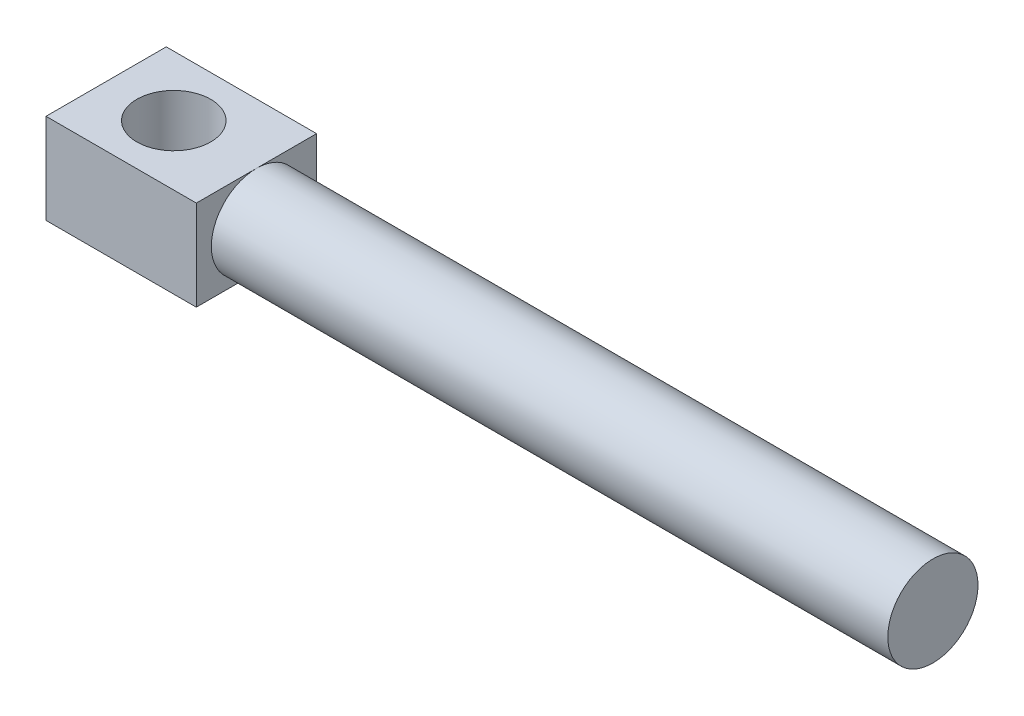
ISO-10303-21;
HEADER;
FILE_DESCRIPTION(('STEP AP214'),'2;1');
FILE_NAME('part.step','',(''),(''),'','','');
FILE_SCHEMA(('AUTOMOTIVE_DESIGN { 1 0 10303 214 1 1 1 1 }'));
ENDSEC;
DATA;
#1=APPLICATION_CONTEXT('core data for automotive mechanical design processes');
#2=APPLICATION_PROTOCOL_DEFINITION('international standard','automotive_design',2000,#1);
#3=PRODUCT_CONTEXT('',#1,'mechanical');
#4=PRODUCT('Part','Part','',(#3));
#5=PRODUCT_RELATED_PRODUCT_CATEGORY('part','',(#4));
#6=PRODUCT_DEFINITION_FORMATION('','',#4);
#7=PRODUCT_DEFINITION_CONTEXT('part definition',#1,'design');
#8=PRODUCT_DEFINITION('design','',#6,#7);
#9=PRODUCT_DEFINITION_SHAPE('','',#8);
#10=(LENGTH_UNIT() NAMED_UNIT(*) SI_UNIT(.MILLI.,.METRE.));
#11=(NAMED_UNIT(*) PLANE_ANGLE_UNIT() SI_UNIT($,.RADIAN.));
#12=(NAMED_UNIT(*) SI_UNIT($,.STERADIAN.) SOLID_ANGLE_UNIT());
#13=UNCERTAINTY_MEASURE_WITH_UNIT(LENGTH_MEASURE(1.E-05),#10,'distance_accuracy_value','');
#14=(GEOMETRIC_REPRESENTATION_CONTEXT(3) GLOBAL_UNCERTAINTY_ASSIGNED_CONTEXT((#13)) GLOBAL_UNIT_ASSIGNED_CONTEXT((#10,
#11,#12)) REPRESENTATION_CONTEXT('',''));
#15=CARTESIAN_POINT('',(0.,0.,0.));
#16=DIRECTION('',(0.,0.,1.));
#17=DIRECTION('',(1.,0.,0.));
#18=AXIS2_PLACEMENT_3D('',#15,#16,#17);
#19=CARTESIAN_POINT('',(5.,6.,-4.));
#20=DIRECTION('',(-1.,0.,0.));
#21=DIRECTION('',(0.,0.,1.));
#22=AXIS2_PLACEMENT_3D('',#19,#20,#21);
#23=PLANE('',#22);
#24=CARTESIAN_POINT('',(5.,3.,0.));
#25=DIRECTION('',(1.,0.,0.));
#26=DIRECTION('',(0.,0.,-1.));
#27=AXIS2_PLACEMENT_3D('',#24,#25,#26);
#28=CIRCLE('',#27,3.);
#29=CARTESIAN_POINT('',(5.,6.,0.));
#30=VERTEX_POINT('',#29);
#31=CARTESIAN_POINT('',(5.,0.,0.));
#32=VERTEX_POINT('',#31);
#33=EDGE_CURVE('E47',#30,#32,#28,.T.);
#34=ORIENTED_EDGE('',*,*,#33,.F.);
#35=DIRECTION('',(0.,0.,-1.));
#36=VECTOR('',#35,1.);
#37=CARTESIAN_POINT('',(5.,6.,-4.));
#38=LINE('',#37,#36);
#39=CARTESIAN_POINT('',(5.,6.,4.));
#40=VERTEX_POINT('',#39);
#41=EDGE_CURVE('E90',#40,#30,#38,.T.);
#42=ORIENTED_EDGE('',*,*,#41,.F.);
#43=DIRECTION('',(0.,-1.,0.));
#44=VECTOR('',#43,1.);
#45=CARTESIAN_POINT('',(5.,6.,4.));
#46=LINE('',#45,#44);
#47=CARTESIAN_POINT('',(5.,0.,4.));
#48=VERTEX_POINT('',#47);
#49=EDGE_CURVE('E159',#40,#48,#46,.T.);
#50=ORIENTED_EDGE('',*,*,#49,.T.);
#51=DIRECTION('',(0.,0.,-1.));
#52=VECTOR('',#51,1.);
#53=CARTESIAN_POINT('',(5.,0.,-4.));
#54=LINE('',#53,#52);
#55=EDGE_CURVE('E101',#48,#32,#54,.T.);
#56=ORIENTED_EDGE('',*,*,#55,.T.);
#57=EDGE_LOOP('',(#34,#42,#50,#56));
#58=FACE_BOUND('',#57,.T.);
#59=ADVANCED_FACE('F37',(#58),#23,.F.);
#60=EDGE_CURVE('E11',#32,#30,#28,.T.);
#61=ORIENTED_EDGE('',*,*,#60,.F.);
#62=CARTESIAN_POINT('',(5.,0.,-4.));
#63=VERTEX_POINT('',#62);
#64=EDGE_CURVE('E153',#32,#63,#54,.T.);
#65=ORIENTED_EDGE('',*,*,#64,.T.);
#66=DIRECTION('',(0.,-1.,0.));
#67=VECTOR('',#66,1.);
#68=CARTESIAN_POINT('',(5.,6.,-4.));
#69=LINE('',#68,#67);
#70=CARTESIAN_POINT('',(5.,6.,-4.));
#71=VERTEX_POINT('',#70);
#72=EDGE_CURVE('E41',#71,#63,#69,.T.);
#73=ORIENTED_EDGE('',*,*,#72,.F.);
#74=EDGE_CURVE('E86',#30,#71,#38,.T.);
#75=ORIENTED_EDGE('',*,*,#74,.F.);
#76=EDGE_LOOP('',(#61,#65,#73,#75));
#77=FACE_BOUND('',#76,.T.);
#78=ADVANCED_FACE('F39',(#77),#23,.F.);
#79=CARTESIAN_POINT('',(-5.,6.,-4.));
#80=DIRECTION('',(0.,0.,1.));
#81=DIRECTION('',(1.,0.,0.));
#82=AXIS2_PLACEMENT_3D('',#79,#80,#81);
#83=PLANE('',#82);
#84=DIRECTION('',(-1.,0.,0.));
#85=VECTOR('',#84,1.);
#86=CARTESIAN_POINT('',(-5.,0.,-4.));
#87=LINE('',#86,#85);
#88=CARTESIAN_POINT('',(-5.,0.,-4.));
#89=VERTEX_POINT('',#88);
#90=EDGE_CURVE('E161',#63,#89,#87,.T.);
#91=ORIENTED_EDGE('',*,*,#90,.T.);
#92=DIRECTION('',(0.,-1.,0.));
#93=VECTOR('',#92,1.);
#94=CARTESIAN_POINT('',(-5.,6.,-4.));
#95=LINE('',#94,#93);
#96=CARTESIAN_POINT('',(-5.,6.,-4.));
#97=VERTEX_POINT('',#96);
#98=EDGE_CURVE('E168',#97,#89,#95,.T.);
#99=ORIENTED_EDGE('',*,*,#98,.F.);
#100=DIRECTION('',(-1.,0.,0.));
#101=VECTOR('',#100,1.);
#102=CARTESIAN_POINT('',(-5.,6.,-4.));
#103=LINE('',#102,#101);
#104=EDGE_CURVE('E94',#71,#97,#103,.T.);
#105=ORIENTED_EDGE('',*,*,#104,.F.);
#106=ORIENTED_EDGE('',*,*,#72,.T.);
#107=EDGE_LOOP('',(#91,#99,#105,#106));
#108=FACE_BOUND('',#107,.T.);
#109=ADVANCED_FACE('F126',(#108),#83,.F.);
#110=CARTESIAN_POINT('',(-5.,6.,-4.));
#111=DIRECTION('',(1.,0.,0.));
#112=DIRECTION('',(0.,0.,-1.));
#113=AXIS2_PLACEMENT_3D('',#110,#111,#112);
#114=PLANE('',#113);
#115=DIRECTION('',(0.,0.,1.));
#116=VECTOR('',#115,1.);
#117=CARTESIAN_POINT('',(-5.,0.,-4.));
#118=LINE('',#117,#116);
#119=CARTESIAN_POINT('',(-5.,0.,4.));
#120=VERTEX_POINT('',#119);
#121=EDGE_CURVE('E163',#89,#120,#118,.T.);
#122=ORIENTED_EDGE('',*,*,#121,.T.);
#123=DIRECTION('',(0.,-1.,0.));
#124=VECTOR('',#123,1.);
#125=CARTESIAN_POINT('',(-5.,6.,4.));
#126=LINE('',#125,#124);
#127=CARTESIAN_POINT('',(-5.,6.,4.));
#128=VERTEX_POINT('',#127);
#129=EDGE_CURVE('E167',#128,#120,#126,.T.);
#130=ORIENTED_EDGE('',*,*,#129,.F.);
#131=DIRECTION('',(0.,0.,1.));
#132=VECTOR('',#131,1.);
#133=CARTESIAN_POINT('',(-5.,6.,-4.));
#134=LINE('',#133,#132);
#135=EDGE_CURVE('E156',#97,#128,#134,.T.);
#136=ORIENTED_EDGE('',*,*,#135,.F.);
#137=ORIENTED_EDGE('',*,*,#98,.T.);
#138=EDGE_LOOP('',(#122,#130,#136,#137));
#139=FACE_BOUND('',#138,.T.);
#140=ADVANCED_FACE('F130',(#139),#114,.F.);
#141=CARTESIAN_POINT('',(-5.,6.,4.));
#142=DIRECTION('',(0.,0.,-1.));
#143=DIRECTION('',(-1.,0.,0.));
#144=AXIS2_PLACEMENT_3D('',#141,#142,#143);
#145=PLANE('',#144);
#146=DIRECTION('',(1.,0.,0.));
#147=VECTOR('',#146,1.);
#148=CARTESIAN_POINT('',(-5.,0.,4.));
#149=LINE('',#148,#147);
#150=EDGE_CURVE('E81',#120,#48,#149,.T.);
#151=ORIENTED_EDGE('',*,*,#150,.T.);
#152=ORIENTED_EDGE('',*,*,#49,.F.);
#153=DIRECTION('',(1.,0.,0.));
#154=VECTOR('',#153,1.);
#155=CARTESIAN_POINT('',(-5.,6.,4.));
#156=LINE('',#155,#154);
#157=EDGE_CURVE('E61',#128,#40,#156,.T.);
#158=ORIENTED_EDGE('',*,*,#157,.F.);
#159=ORIENTED_EDGE('',*,*,#129,.T.);
#160=EDGE_LOOP('',(#151,#152,#158,#159));
#161=FACE_BOUND('',#160,.T.);
#162=ADVANCED_FACE('F135',(#161),#145,.F.);
#163=CARTESIAN_POINT('',(0.,6.,0.));
#164=DIRECTION('',(0.,1.,0.));
#165=DIRECTION('',(0.,0.,1.));
#166=AXIS2_PLACEMENT_3D('',#163,#164,#165);
#167=PLANE('',#166);
#168=CARTESIAN_POINT('',(-0.5,6.,0.));
#169=DIRECTION('',(0.,1.,0.));
#170=DIRECTION('',(0.,0.,1.));
#171=AXIS2_PLACEMENT_3D('',#168,#169,#170);
#172=CIRCLE('',#171,2.46);
#173=CARTESIAN_POINT('',(-0.5,6.,2.46));
#174=VERTEX_POINT('',#173);
#175=EDGE_CURVE('E146',#174,#174,#172,.T.);
#176=ORIENTED_EDGE('',*,*,#175,.F.);
#177=EDGE_LOOP('',(#176));
#178=FACE_BOUND('',#177,.T.);
#179=ORIENTED_EDGE('',*,*,#41,.T.);
#180=ORIENTED_EDGE('',*,*,#74,.T.);
#181=ORIENTED_EDGE('',*,*,#104,.T.);
#182=ORIENTED_EDGE('',*,*,#135,.T.);
#183=ORIENTED_EDGE('',*,*,#157,.T.);
#184=EDGE_LOOP('',(#179,#180,#181,#182,#183));
#185=FACE_BOUND('',#184,.T.);
#186=ADVANCED_FACE('F91',(#178,#185),#167,.T.);
#187=CARTESIAN_POINT('',(0.,0.,0.));
#188=DIRECTION('',(0.,1.,0.));
#189=DIRECTION('',(0.,0.,1.));
#190=AXIS2_PLACEMENT_3D('',#187,#188,#189);
#191=PLANE('',#190);
#192=CARTESIAN_POINT('',(-0.5,0.,0.));
#193=DIRECTION('',(0.,1.,0.));
#194=DIRECTION('',(0.,0.,1.));
#195=AXIS2_PLACEMENT_3D('',#192,#193,#194);
#196=CIRCLE('',#195,2.46);
#197=CARTESIAN_POINT('',(-0.5,0.,2.46));
#198=VERTEX_POINT('',#197);
#199=EDGE_CURVE('E104',#198,#198,#196,.F.);
#200=ORIENTED_EDGE('',*,*,#199,.F.);
#201=EDGE_LOOP('',(#200));
#202=FACE_BOUND('',#201,.T.);
#203=ORIENTED_EDGE('',*,*,#55,.F.);
#204=ORIENTED_EDGE('',*,*,#150,.F.);
#205=ORIENTED_EDGE('',*,*,#121,.F.);
#206=ORIENTED_EDGE('',*,*,#90,.F.);
#207=ORIENTED_EDGE('',*,*,#64,.F.);
#208=EDGE_LOOP('',(#203,#204,#205,#206,#207));
#209=FACE_BOUND('',#208,.T.);
#210=ADVANCED_FACE('F108',(#202,#209),#191,.F.);
#211=CARTESIAN_POINT('',(50.,3.,0.));
#212=DIRECTION('',(-1.,0.,0.));
#213=DIRECTION('',(0.,0.,1.));
#214=AXIS2_PLACEMENT_3D('',#211,#212,#213);
#215=CYLINDRICAL_SURFACE('',#214,3.);
#216=CARTESIAN_POINT('',(50.,3.,0.));
#217=DIRECTION('',(1.,0.,0.));
#218=DIRECTION('',(0.,0.,-1.));
#219=AXIS2_PLACEMENT_3D('',#216,#217,#218);
#220=CIRCLE('',#219,3.);
#221=CARTESIAN_POINT('',(50.,3.,-3.));
#222=VERTEX_POINT('',#221);
#223=EDGE_CURVE('E103',#222,#222,#220,.T.);
#224=ORIENTED_EDGE('',*,*,#223,.F.);
#225=EDGE_LOOP('',(#224));
#226=FACE_BOUND('',#225,.T.);
#227=ORIENTED_EDGE('',*,*,#33,.T.);
#228=ORIENTED_EDGE('',*,*,#60,.T.);
#229=EDGE_LOOP('',(#227,#228));
#230=FACE_BOUND('',#229,.T.);
#231=ADVANCED_FACE('F105',(#226,#230),#215,.T.);
#232=CARTESIAN_POINT('',(50.,0.,0.));
#233=DIRECTION('',(1.,0.,0.));
#234=DIRECTION('',(0.,0.,-1.));
#235=AXIS2_PLACEMENT_3D('',#232,#233,#234);
#236=PLANE('',#235);
#237=ORIENTED_EDGE('',*,*,#223,.T.);
#238=EDGE_LOOP('',(#237));
#239=FACE_BOUND('',#238,.T.);
#240=ADVANCED_FACE('F107',(#239),#236,.T.);
#241=CARTESIAN_POINT('',(-0.5,-0.00100000000000013,0.));
#242=DIRECTION('',(0.,1.,0.));
#243=DIRECTION('',(0.,0.,1.));
#244=AXIS2_PLACEMENT_3D('',#241,#242,#243);
#245=CYLINDRICAL_SURFACE('',#244,2.46);
#246=CARTESIAN_POINT('',(-0.5,6.,2.46));
#247=CARTESIAN_POINT('',(-0.5,5.9375,2.46));
#248=CARTESIAN_POINT('',(-0.5,5.875,2.46));
#249=CARTESIAN_POINT('',(-0.5,5.75,2.46));
#250=CARTESIAN_POINT('',(-0.5,5.6875,2.46));
#251=CARTESIAN_POINT('',(-0.5,5.5625,2.46));
#252=CARTESIAN_POINT('',(-0.5,5.5,2.46));
#253=CARTESIAN_POINT('',(-0.5,5.375,2.46));
#254=CARTESIAN_POINT('',(-0.5,5.3125,2.46));
#255=CARTESIAN_POINT('',(-0.5,5.1875,2.46));
#256=CARTESIAN_POINT('',(-0.5,5.125,2.46));
#257=CARTESIAN_POINT('',(-0.5,5.,2.46));
#258=CARTESIAN_POINT('',(-0.5,4.9375,2.46));
#259=CARTESIAN_POINT('',(-0.5,4.8125,2.46));
#260=CARTESIAN_POINT('',(-0.5,4.75,2.46));
#261=CARTESIAN_POINT('',(-0.5,4.625,2.46));
#262=CARTESIAN_POINT('',(-0.5,4.5625,2.46));
#263=CARTESIAN_POINT('',(-0.5,4.4375,2.46));
#264=CARTESIAN_POINT('',(-0.5,4.375,2.46));
#265=CARTESIAN_POINT('',(-0.5,4.25,2.46));
#266=CARTESIAN_POINT('',(-0.5,4.1875,2.46));
#267=CARTESIAN_POINT('',(-0.5,4.0625,2.46));
#268=CARTESIAN_POINT('',(-0.5,4.,2.46));
#269=CARTESIAN_POINT('',(-0.5,3.875,2.46));
#270=CARTESIAN_POINT('',(-0.5,3.8125,2.46));
#271=CARTESIAN_POINT('',(-0.5,3.6875,2.46));
#272=CARTESIAN_POINT('',(-0.5,3.625,2.46));
#273=CARTESIAN_POINT('',(-0.5,3.5,2.46));
#274=CARTESIAN_POINT('',(-0.5,3.4375,2.46));
#275=CARTESIAN_POINT('',(-0.5,3.3125,2.46));
#276=CARTESIAN_POINT('',(-0.5,3.25,2.46));
#277=CARTESIAN_POINT('',(-0.5,3.125,2.46));
#278=CARTESIAN_POINT('',(-0.5,3.0625,2.46));
#279=CARTESIAN_POINT('',(-0.5,2.9375,2.46));
#280=CARTESIAN_POINT('',(-0.5,2.875,2.46));
#281=CARTESIAN_POINT('',(-0.5,2.75,2.46));
#282=CARTESIAN_POINT('',(-0.5,2.6875,2.46));
#283=CARTESIAN_POINT('',(-0.5,2.5625,2.46));
#284=CARTESIAN_POINT('',(-0.5,2.5,2.46));
#285=CARTESIAN_POINT('',(-0.5,2.375,2.46));
#286=CARTESIAN_POINT('',(-0.5,2.3125,2.46));
#287=CARTESIAN_POINT('',(-0.5,2.1875,2.46));
#288=CARTESIAN_POINT('',(-0.5,2.125,2.46));
#289=CARTESIAN_POINT('',(-0.5,2.,2.46));
#290=CARTESIAN_POINT('',(-0.5,1.9375,2.46));
#291=CARTESIAN_POINT('',(-0.5,1.8125,2.46));
#292=CARTESIAN_POINT('',(-0.5,1.75,2.46));
#293=CARTESIAN_POINT('',(-0.5,1.625,2.46));
#294=CARTESIAN_POINT('',(-0.5,1.5625,2.46));
#295=CARTESIAN_POINT('',(-0.5,1.4375,2.46));
#296=CARTESIAN_POINT('',(-0.5,1.375,2.46));
#297=CARTESIAN_POINT('',(-0.5,1.25,2.46));
#298=CARTESIAN_POINT('',(-0.5,1.1875,2.46));
#299=CARTESIAN_POINT('',(-0.5,1.0625,2.46));
#300=CARTESIAN_POINT('',(-0.5,1.,2.46));
#301=CARTESIAN_POINT('',(-0.5,0.875,2.46));
#302=CARTESIAN_POINT('',(-0.5,0.8125,2.46));
#303=CARTESIAN_POINT('',(-0.5,0.6875,2.46));
#304=CARTESIAN_POINT('',(-0.5,0.625,2.46));
#305=CARTESIAN_POINT('',(-0.5,0.5,2.46));
#306=CARTESIAN_POINT('',(-0.5,0.4375,2.46));
#307=CARTESIAN_POINT('',(-0.5,0.3125,2.46));
#308=CARTESIAN_POINT('',(-0.5,0.25,2.46));
#309=CARTESIAN_POINT('',(-0.5,0.125,2.46));
#310=CARTESIAN_POINT('',(-0.5,0.0625000000000001,2.46));
#311=CARTESIAN_POINT('',(-0.5,0.,2.46));
#312=B_SPLINE_CURVE_WITH_KNOTS('',3,(#246,#247,#248,#249,#250,#251,#252,#253,#254,#255,#256,
#257,#258,#259,#260,#261,#262,#263,#264,#265,#266,#267,#268,#269,#270,#271,#272,#273,#274,#275,
#276,#277,#278,#279,#280,#281,#282,#283,#284,#285,#286,#287,#288,#289,#290,#291,#292,#293,#294,
#295,#296,#297,#298,#299,#300,#301,#302,#303,#304,#305,#306,#307,#308,#309,#310,#311),
.UNSPECIFIED.,.F.,.F.,(4,2,2,2,2,2,2,2,2,2,2,2,2,2,2,2,2,2,2,2,2,2,2,2,2,2,2,2,2,2,2,2,4),(0.,
0.1875,0.375,0.5625,0.75,0.9375,1.125,1.3125,1.5,1.6875,1.875,2.0625,2.25,2.4375,2.625,2.8125,
3.,3.1875,3.375,3.5625,3.75,3.9375,4.125,4.3125,4.5,4.6875,4.875,5.0625,5.25,5.4375,5.625,
5.8125,6.),.UNSPECIFIED.);
#313=EDGE_CURVE('BSEAM115',#174,#198,#312,.T.);
#314=ORIENTED_EDGE('',*,*,#175,.T.);
#315=ORIENTED_EDGE('',*,*,#199,.T.);
#316=ORIENTED_EDGE('',*,*,#313,.T.);
#317=ORIENTED_EDGE('',*,*,#313,.F.);
#318=EDGE_LOOP('',(#314,#316,#315,#317));
#319=FACE_BOUND('',#318,.T.);
#320=ADVANCED_FACE('F115',(#319),#245,.F.);
#321=CLOSED_SHELL('',(#59,#78,#109,#140,#162,#186,#210,#231,#240,#320));
#322=MANIFOLD_SOLID_BREP('B2',#321);
#323=ADVANCED_BREP_SHAPE_REPRESENTATION('',(#18,#322),#14);
#324=SHAPE_DEFINITION_REPRESENTATION(#9,#323);
ENDSEC;
END-ISO-10303-21;
